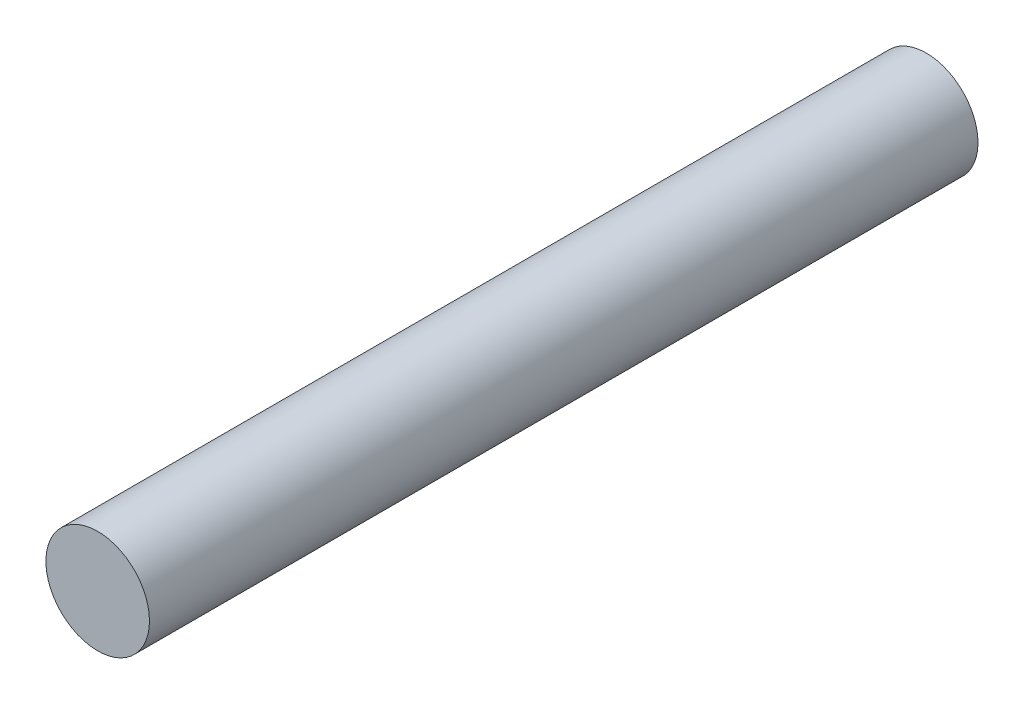
ISO-10303-21;
HEADER;
FILE_DESCRIPTION(('STEP AP214'),'2;1');
FILE_NAME('part.step','',(''),(''),'','','');
FILE_SCHEMA(('AUTOMOTIVE_DESIGN { 1 0 10303 214 1 1 1 1 }'));
ENDSEC;
DATA;
#1=APPLICATION_CONTEXT('core data for automotive mechanical design processes');
#2=APPLICATION_PROTOCOL_DEFINITION('international standard','automotive_design',2000,#1);
#3=PRODUCT_CONTEXT('',#1,'mechanical');
#4=PRODUCT('Part','Part','',(#3));
#5=PRODUCT_RELATED_PRODUCT_CATEGORY('part','',(#4));
#6=PRODUCT_DEFINITION_FORMATION('','',#4);
#7=PRODUCT_DEFINITION_CONTEXT('part definition',#1,'design');
#8=PRODUCT_DEFINITION('design','',#6,#7);
#9=PRODUCT_DEFINITION_SHAPE('','',#8);
#10=(LENGTH_UNIT() NAMED_UNIT(*) SI_UNIT(.MILLI.,.METRE.));
#11=(NAMED_UNIT(*) PLANE_ANGLE_UNIT() SI_UNIT($,.RADIAN.));
#12=(NAMED_UNIT(*) SI_UNIT($,.STERADIAN.) SOLID_ANGLE_UNIT());
#13=UNCERTAINTY_MEASURE_WITH_UNIT(LENGTH_MEASURE(1.E-05),#10,'distance_accuracy_value','');
#14=(GEOMETRIC_REPRESENTATION_CONTEXT(3) GLOBAL_UNCERTAINTY_ASSIGNED_CONTEXT((#13)) GLOBAL_UNIT_ASSIGNED_CONTEXT((#10,
#11,#12)) REPRESENTATION_CONTEXT('',''));
#15=CARTESIAN_POINT('',(0.,0.,0.));
#16=DIRECTION('',(0.,0.,1.));
#17=DIRECTION('',(1.,0.,0.));
#18=AXIS2_PLACEMENT_3D('',#15,#16,#17);
#19=CARTESIAN_POINT('',(0.,0.,48.));
#20=DIRECTION('',(0.,0.,-1.));
#21=DIRECTION('',(-1.,0.,0.));
#22=AXIS2_PLACEMENT_3D('',#19,#20,#21);
#23=CYLINDRICAL_SURFACE('',#22,3.);
#24=CARTESIAN_POINT('',(0.,0.,48.));
#25=DIRECTION('',(0.,0.,1.));
#26=DIRECTION('',(1.,0.,0.));
#27=AXIS2_PLACEMENT_3D('',#24,#25,#26);
#28=CIRCLE('',#27,3.);
#29=CARTESIAN_POINT('',(3.,0.,48.));
#30=VERTEX_POINT('',#29);
#31=EDGE_CURVE('E10',#30,#30,#28,.T.);
#32=ORIENTED_EDGE('',*,*,#31,.F.);
#33=EDGE_LOOP('',(#32));
#34=FACE_BOUND('',#33,.T.);
#35=CARTESIAN_POINT('',(0.,0.,0.));
#36=DIRECTION('',(0.,0.,1.));
#37=DIRECTION('',(1.,0.,0.));
#38=AXIS2_PLACEMENT_3D('',#35,#36,#37);
#39=CIRCLE('',#38,3.);
#40=CARTESIAN_POINT('',(3.,0.,0.));
#41=VERTEX_POINT('',#40);
#42=EDGE_CURVE('E34',#41,#41,#39,.T.);
#43=ORIENTED_EDGE('',*,*,#42,.T.);
#44=EDGE_LOOP('',(#43));
#45=FACE_BOUND('',#44,.T.);
#46=ADVANCED_FACE('F31',(#34,#45),#23,.T.);
#47=CARTESIAN_POINT('',(0.,0.,48.));
#48=DIRECTION('',(0.,0.,1.));
#49=DIRECTION('',(1.,0.,0.));
#50=AXIS2_PLACEMENT_3D('',#47,#48,#49);
#51=PLANE('',#50);
#52=ORIENTED_EDGE('',*,*,#31,.T.);
#53=EDGE_LOOP('',(#52));
#54=FACE_BOUND('',#53,.T.);
#55=ADVANCED_FACE('F46',(#54),#51,.T.);
#56=CARTESIAN_POINT('',(0.,0.,0.));
#57=DIRECTION('',(0.,0.,1.));
#58=DIRECTION('',(1.,0.,0.));
#59=AXIS2_PLACEMENT_3D('',#56,#57,#58);
#60=PLANE('',#59);
#61=ORIENTED_EDGE('',*,*,#42,.F.);
#62=EDGE_LOOP('',(#61));
#63=FACE_BOUND('',#62,.T.);
#64=ADVANCED_FACE('F44',(#63),#60,.F.);
#65=CLOSED_SHELL('',(#46,#55,#64));
#66=MANIFOLD_SOLID_BREP('B2',#65);
#67=ADVANCED_BREP_SHAPE_REPRESENTATION('',(#18,#66),#14);
#68=SHAPE_DEFINITION_REPRESENTATION(#9,#67);
ENDSEC;
END-ISO-10303-21;
